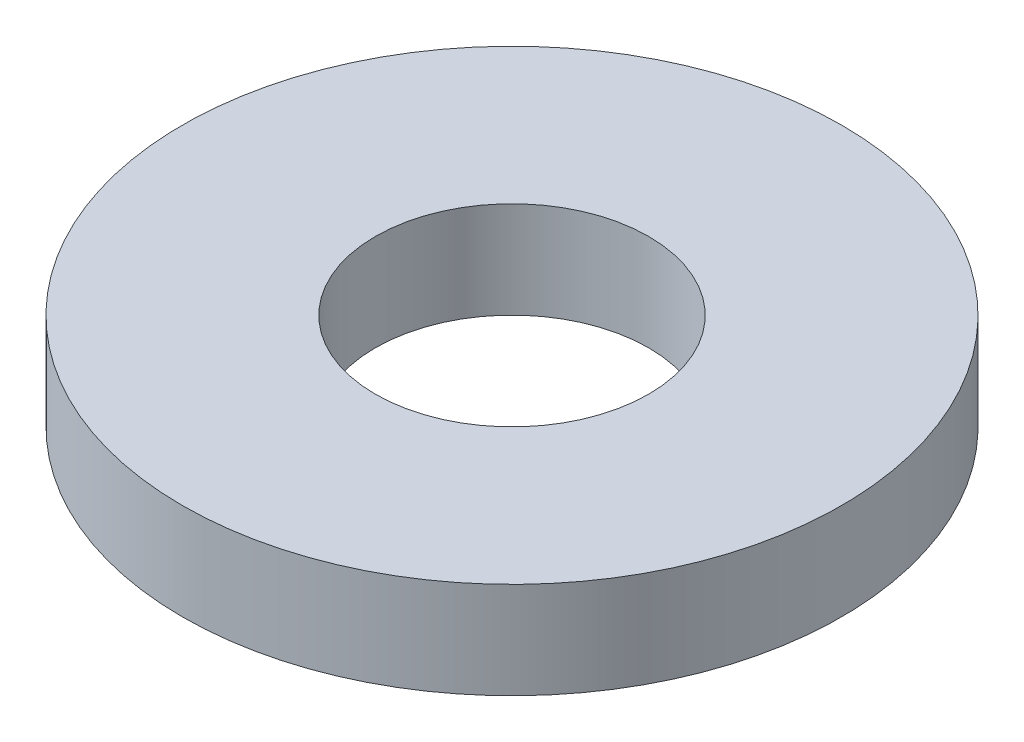
ISO-10303-21;
HEADER;
FILE_DESCRIPTION(('STEP AP214'),'2;1');
FILE_NAME('part.step','',(''),(''),'','','');
FILE_SCHEMA(('AUTOMOTIVE_DESIGN { 1 0 10303 214 1 1 1 1 }'));
ENDSEC;
DATA;
#1=APPLICATION_CONTEXT('core data for automotive mechanical design processes');
#2=APPLICATION_PROTOCOL_DEFINITION('international standard','automotive_design',2000,#1);
#3=PRODUCT_CONTEXT('',#1,'mechanical');
#4=PRODUCT('Part','Part','',(#3));
#5=PRODUCT_RELATED_PRODUCT_CATEGORY('part','',(#4));
#6=PRODUCT_DEFINITION_FORMATION('','',#4);
#7=PRODUCT_DEFINITION_CONTEXT('part definition',#1,'design');
#8=PRODUCT_DEFINITION('design','',#6,#7);
#9=PRODUCT_DEFINITION_SHAPE('','',#8);
#10=(LENGTH_UNIT() NAMED_UNIT(*) SI_UNIT(.MILLI.,.METRE.));
#11=(NAMED_UNIT(*) PLANE_ANGLE_UNIT() SI_UNIT($,.RADIAN.));
#12=(NAMED_UNIT(*) SI_UNIT($,.STERADIAN.) SOLID_ANGLE_UNIT());
#13=UNCERTAINTY_MEASURE_WITH_UNIT(LENGTH_MEASURE(1.E-05),#10,'distance_accuracy_value','');
#14=(GEOMETRIC_REPRESENTATION_CONTEXT(3) GLOBAL_UNCERTAINTY_ASSIGNED_CONTEXT((#13)) GLOBAL_UNIT_ASSIGNED_CONTEXT((#10,
#11,#12)) REPRESENTATION_CONTEXT('',''));
#15=CARTESIAN_POINT('',(0.,0.,0.));
#16=DIRECTION('',(0.,0.,1.));
#17=DIRECTION('',(1.,0.,0.));
#18=AXIS2_PLACEMENT_3D('',#15,#16,#17);
#19=CARTESIAN_POINT('',(0.,1.524,0.));
#20=DIRECTION('',(0.,1.,0.));
#21=DIRECTION('',(0.,0.,1.));
#22=AXIS2_PLACEMENT_3D('',#19,#20,#21);
#23=PLANE('',#22);
#24=CARTESIAN_POINT('',(0.,1.524,0.));
#25=DIRECTION('',(0.,1.,0.));
#26=DIRECTION('',(0.,0.,1.));
#27=AXIS2_PLACEMENT_3D('',#24,#25,#26);
#28=CIRCLE('',#27,5.207);
#29=CARTESIAN_POINT('',(0.,1.524,-5.207));
#30=VERTEX_POINT('',#29);
#31=EDGE_CURVE('E10',#30,#30,#28,.T.);
#32=ORIENTED_EDGE('',*,*,#31,.T.);
#33=EDGE_LOOP('',(#32));
#34=FACE_BOUND('',#33,.T.);
#35=CARTESIAN_POINT('',(0.,1.524,0.));
#36=DIRECTION('',(0.,1.,0.));
#37=DIRECTION('',(0.,0.,1.));
#38=AXIS2_PLACEMENT_3D('',#35,#36,#37);
#39=CIRCLE('',#38,2.159);
#40=CARTESIAN_POINT('',(0.,1.524,-2.159));
#41=VERTEX_POINT('',#40);
#42=EDGE_CURVE('E46',#41,#41,#39,.T.);
#43=ORIENTED_EDGE('',*,*,#42,.F.);
#44=EDGE_LOOP('',(#43));
#45=FACE_BOUND('',#44,.T.);
#46=ADVANCED_FACE('F35',(#34,#45),#23,.T.);
#47=CARTESIAN_POINT('',(0.,0.,0.));
#48=DIRECTION('',(0.,1.,0.));
#49=DIRECTION('',(0.,0.,1.));
#50=AXIS2_PLACEMENT_3D('',#47,#48,#49);
#51=PLANE('',#50);
#52=CARTESIAN_POINT('',(0.,0.,0.));
#53=DIRECTION('',(0.,1.,0.));
#54=DIRECTION('',(0.,0.,1.));
#55=AXIS2_PLACEMENT_3D('',#52,#53,#54);
#56=CIRCLE('',#55,5.207);
#57=CARTESIAN_POINT('',(0.,0.,-5.207));
#58=VERTEX_POINT('',#57);
#59=EDGE_CURVE('E39',#58,#58,#56,.T.);
#60=ORIENTED_EDGE('',*,*,#59,.F.);
#61=EDGE_LOOP('',(#60));
#62=FACE_BOUND('',#61,.T.);
#63=CARTESIAN_POINT('',(0.,0.,0.));
#64=DIRECTION('',(0.,1.,0.));
#65=DIRECTION('',(0.,0.,1.));
#66=AXIS2_PLACEMENT_3D('',#63,#64,#65);
#67=CIRCLE('',#66,2.159);
#68=CARTESIAN_POINT('',(0.,0.,-2.159));
#69=VERTEX_POINT('',#68);
#70=EDGE_CURVE('E48',#69,#69,#67,.T.);
#71=ORIENTED_EDGE('',*,*,#70,.T.);
#72=EDGE_LOOP('',(#71));
#73=FACE_BOUND('',#72,.T.);
#74=ADVANCED_FACE('F58',(#62,#73),#51,.F.);
#75=CARTESIAN_POINT('',(0.,1.524,0.));
#76=DIRECTION('',(0.,-1.,0.));
#77=DIRECTION('',(0.,0.,-1.));
#78=AXIS2_PLACEMENT_3D('',#75,#76,#77);
#79=CYLINDRICAL_SURFACE('',#78,5.207);
#80=CARTESIAN_POINT('',(0.,1.524,-5.207));
#81=CARTESIAN_POINT('',(0.,1.508125,-5.207));
#82=CARTESIAN_POINT('',(0.,1.49225,-5.207));
#83=CARTESIAN_POINT('',(0.,1.4605,-5.207));
#84=CARTESIAN_POINT('',(0.,1.444625,-5.207));
#85=CARTESIAN_POINT('',(0.,1.412875,-5.207));
#86=CARTESIAN_POINT('',(0.,1.397,-5.207));
#87=CARTESIAN_POINT('',(0.,1.36525,-5.207));
#88=CARTESIAN_POINT('',(0.,1.349375,-5.207));
#89=CARTESIAN_POINT('',(0.,1.317625,-5.207));
#90=CARTESIAN_POINT('',(0.,1.30175,-5.207));
#91=CARTESIAN_POINT('',(0.,1.27,-5.207));
#92=CARTESIAN_POINT('',(0.,1.254125,-5.207));
#93=CARTESIAN_POINT('',(0.,1.222375,-5.207));
#94=CARTESIAN_POINT('',(0.,1.2065,-5.207));
#95=CARTESIAN_POINT('',(0.,1.17475,-5.207));
#96=CARTESIAN_POINT('',(0.,1.158875,-5.207));
#97=CARTESIAN_POINT('',(0.,1.127125,-5.207));
#98=CARTESIAN_POINT('',(0.,1.11125,-5.207));
#99=CARTESIAN_POINT('',(0.,1.0795,-5.207));
#100=CARTESIAN_POINT('',(0.,1.063625,-5.207));
#101=CARTESIAN_POINT('',(0.,1.031875,-5.207));
#102=CARTESIAN_POINT('',(0.,1.016,-5.207));
#103=CARTESIAN_POINT('',(0.,0.98425,-5.207));
#104=CARTESIAN_POINT('',(0.,0.968375,-5.207));
#105=CARTESIAN_POINT('',(0.,0.936625,-5.207));
#106=CARTESIAN_POINT('',(0.,0.92075,-5.207));
#107=CARTESIAN_POINT('',(0.,0.889,-5.207));
#108=CARTESIAN_POINT('',(0.,0.873125,-5.207));
#109=CARTESIAN_POINT('',(0.,0.841375,-5.207));
#110=CARTESIAN_POINT('',(0.,0.8255,-5.207));
#111=CARTESIAN_POINT('',(0.,0.79375,-5.207));
#112=CARTESIAN_POINT('',(0.,0.777875,-5.207));
#113=CARTESIAN_POINT('',(0.,0.746125,-5.207));
#114=CARTESIAN_POINT('',(0.,0.73025,-5.207));
#115=CARTESIAN_POINT('',(0.,0.6985,-5.207));
#116=CARTESIAN_POINT('',(0.,0.682625,-5.207));
#117=CARTESIAN_POINT('',(0.,0.650875,-5.207));
#118=CARTESIAN_POINT('',(0.,0.635,-5.207));
#119=CARTESIAN_POINT('',(0.,0.60325,-5.207));
#120=CARTESIAN_POINT('',(0.,0.587375,-5.207));
#121=CARTESIAN_POINT('',(0.,0.555625,-5.207));
#122=CARTESIAN_POINT('',(0.,0.53975,-5.207));
#123=CARTESIAN_POINT('',(0.,0.508,-5.207));
#124=CARTESIAN_POINT('',(0.,0.492125,-5.207));
#125=CARTESIAN_POINT('',(0.,0.460375,-5.207));
#126=CARTESIAN_POINT('',(0.,0.4445,-5.207));
#127=CARTESIAN_POINT('',(0.,0.41275,-5.207));
#128=CARTESIAN_POINT('',(0.,0.396875,-5.207));
#129=CARTESIAN_POINT('',(0.,0.365125,-5.207));
#130=CARTESIAN_POINT('',(0.,0.34925,-5.207));
#131=CARTESIAN_POINT('',(0.,0.3175,-5.207));
#132=CARTESIAN_POINT('',(0.,0.301625,-5.207));
#133=CARTESIAN_POINT('',(0.,0.269875,-5.207));
#134=CARTESIAN_POINT('',(0.,0.254,-5.207));
#135=CARTESIAN_POINT('',(0.,0.22225,-5.207));
#136=CARTESIAN_POINT('',(0.,0.206375,-5.207));
#137=CARTESIAN_POINT('',(0.,0.174625,-5.207));
#138=CARTESIAN_POINT('',(0.,0.15875,-5.207));
#139=CARTESIAN_POINT('',(0.,0.127,-5.207));
#140=CARTESIAN_POINT('',(0.,0.111125,-5.207));
#141=CARTESIAN_POINT('',(0.,0.079375,-5.207));
#142=CARTESIAN_POINT('',(0.,0.0635,-5.207));
#143=CARTESIAN_POINT('',(0.,0.0317499999999999,-5.207));
#144=CARTESIAN_POINT('',(0.,0.015875,-5.207));
#145=CARTESIAN_POINT('',(0.,0.,-5.207));
#146=B_SPLINE_CURVE_WITH_KNOTS('',3,(#80,#81,#82,#83,#84,#85,#86,#87,#88,#89,#90,#91,#92,#93,
#94,#95,#96,#97,#98,#99,#100,#101,#102,#103,#104,#105,#106,#107,#108,#109,#110,#111,#112,#113,
#114,#115,#116,#117,#118,#119,#120,#121,#122,#123,#124,#125,#126,#127,#128,#129,#130,#131,#132,
#133,#134,#135,#136,#137,#138,#139,#140,#141,#142,#143,#144,#145),.UNSPECIFIED.,.F.,.F.,(4,2,2,
2,2,2,2,2,2,2,2,2,2,2,2,2,2,2,2,2,2,2,2,2,2,2,2,2,2,2,2,2,4),(0.,0.0476249999999999,
0.0952499999999998,0.142875,0.1905,0.238125,0.28575,0.333375,0.381,0.428625,0.47625,0.523875,
0.5715,0.619125,0.66675,0.714375,0.762,0.809625,0.85725,0.904875,0.9525,1.000125,1.04775,
1.095375,1.143,1.190625,1.23825,1.285875,1.3335,1.381125,1.42875,1.476375,1.524),.UNSPECIFIED.);
#147=EDGE_CURVE('BSEAM37',#30,#58,#146,.T.);
#148=ORIENTED_EDGE('',*,*,#31,.F.);
#149=ORIENTED_EDGE('',*,*,#59,.T.);
#150=ORIENTED_EDGE('',*,*,#147,.T.);
#151=ORIENTED_EDGE('',*,*,#147,.F.);
#152=EDGE_LOOP('',(#148,#150,#149,#151));
#153=FACE_BOUND('',#152,.T.);
#154=ADVANCED_FACE('F37',(#153),#79,.T.);
#155=CARTESIAN_POINT('',(0.,1.524,0.));
#156=DIRECTION('',(0.,-1.,0.));
#157=DIRECTION('',(0.,0.,-1.));
#158=AXIS2_PLACEMENT_3D('',#155,#156,#157);
#159=CYLINDRICAL_SURFACE('',#158,2.159);
#160=CARTESIAN_POINT('',(0.,1.524,-2.159));
#161=CARTESIAN_POINT('',(0.,1.508125,-2.159));
#162=CARTESIAN_POINT('',(0.,1.49225,-2.159));
#163=CARTESIAN_POINT('',(0.,1.4605,-2.159));
#164=CARTESIAN_POINT('',(0.,1.444625,-2.159));
#165=CARTESIAN_POINT('',(0.,1.412875,-2.159));
#166=CARTESIAN_POINT('',(0.,1.397,-2.159));
#167=CARTESIAN_POINT('',(0.,1.36525,-2.159));
#168=CARTESIAN_POINT('',(0.,1.349375,-2.159));
#169=CARTESIAN_POINT('',(0.,1.317625,-2.159));
#170=CARTESIAN_POINT('',(0.,1.30175,-2.159));
#171=CARTESIAN_POINT('',(0.,1.27,-2.159));
#172=CARTESIAN_POINT('',(0.,1.254125,-2.159));
#173=CARTESIAN_POINT('',(0.,1.222375,-2.159));
#174=CARTESIAN_POINT('',(0.,1.2065,-2.159));
#175=CARTESIAN_POINT('',(0.,1.17475,-2.159));
#176=CARTESIAN_POINT('',(0.,1.158875,-2.159));
#177=CARTESIAN_POINT('',(0.,1.127125,-2.159));
#178=CARTESIAN_POINT('',(0.,1.11125,-2.159));
#179=CARTESIAN_POINT('',(0.,1.0795,-2.159));
#180=CARTESIAN_POINT('',(0.,1.063625,-2.159));
#181=CARTESIAN_POINT('',(0.,1.031875,-2.159));
#182=CARTESIAN_POINT('',(0.,1.016,-2.159));
#183=CARTESIAN_POINT('',(0.,0.98425,-2.159));
#184=CARTESIAN_POINT('',(0.,0.968375,-2.159));
#185=CARTESIAN_POINT('',(0.,0.936625,-2.159));
#186=CARTESIAN_POINT('',(0.,0.92075,-2.159));
#187=CARTESIAN_POINT('',(0.,0.889,-2.159));
#188=CARTESIAN_POINT('',(0.,0.873125,-2.159));
#189=CARTESIAN_POINT('',(0.,0.841375,-2.159));
#190=CARTESIAN_POINT('',(0.,0.8255,-2.159));
#191=CARTESIAN_POINT('',(0.,0.79375,-2.159));
#192=CARTESIAN_POINT('',(0.,0.777875,-2.159));
#193=CARTESIAN_POINT('',(0.,0.746125,-2.159));
#194=CARTESIAN_POINT('',(0.,0.73025,-2.159));
#195=CARTESIAN_POINT('',(0.,0.6985,-2.159));
#196=CARTESIAN_POINT('',(0.,0.682625,-2.159));
#197=CARTESIAN_POINT('',(0.,0.650875,-2.159));
#198=CARTESIAN_POINT('',(0.,0.635,-2.159));
#199=CARTESIAN_POINT('',(0.,0.60325,-2.159));
#200=CARTESIAN_POINT('',(0.,0.587375,-2.159));
#201=CARTESIAN_POINT('',(0.,0.555625,-2.159));
#202=CARTESIAN_POINT('',(0.,0.53975,-2.159));
#203=CARTESIAN_POINT('',(0.,0.508,-2.159));
#204=CARTESIAN_POINT('',(0.,0.492125,-2.159));
#205=CARTESIAN_POINT('',(0.,0.460375,-2.159));
#206=CARTESIAN_POINT('',(0.,0.4445,-2.159));
#207=CARTESIAN_POINT('',(0.,0.41275,-2.159));
#208=CARTESIAN_POINT('',(0.,0.396875,-2.159));
#209=CARTESIAN_POINT('',(0.,0.365125,-2.159));
#210=CARTESIAN_POINT('',(0.,0.34925,-2.159));
#211=CARTESIAN_POINT('',(0.,0.3175,-2.159));
#212=CARTESIAN_POINT('',(0.,0.301625,-2.159));
#213=CARTESIAN_POINT('',(0.,0.269875,-2.159));
#214=CARTESIAN_POINT('',(0.,0.254,-2.159));
#215=CARTESIAN_POINT('',(0.,0.22225,-2.159));
#216=CARTESIAN_POINT('',(0.,0.206375,-2.159));
#217=CARTESIAN_POINT('',(0.,0.174625,-2.159));
#218=CARTESIAN_POINT('',(0.,0.15875,-2.159));
#219=CARTESIAN_POINT('',(0.,0.127,-2.159));
#220=CARTESIAN_POINT('',(0.,0.111125,-2.159));
#221=CARTESIAN_POINT('',(0.,0.079375,-2.159));
#222=CARTESIAN_POINT('',(0.,0.0635,-2.159));
#223=CARTESIAN_POINT('',(0.,0.0317499999999999,-2.159));
#224=CARTESIAN_POINT('',(0.,0.015875,-2.159));
#225=CARTESIAN_POINT('',(0.,0.,-2.159));
#226=B_SPLINE_CURVE_WITH_KNOTS('',3,(#160,#161,#162,#163,#164,#165,#166,#167,#168,#169,#170,
#171,#172,#173,#174,#175,#176,#177,#178,#179,#180,#181,#182,#183,#184,#185,#186,#187,#188,#189,
#190,#191,#192,#193,#194,#195,#196,#197,#198,#199,#200,#201,#202,#203,#204,#205,#206,#207,#208,
#209,#210,#211,#212,#213,#214,#215,#216,#217,#218,#219,#220,#221,#222,#223,#224,#225),
.UNSPECIFIED.,.F.,.F.,(4,2,2,2,2,2,2,2,2,2,2,2,2,2,2,2,2,2,2,2,2,2,2,2,2,2,2,2,2,2,2,2,4),(0.,
0.0476250000000001,0.0952500000000001,0.142875,0.1905,0.238125,0.28575,0.333375,0.381,0.428625,
0.47625,0.523875,0.5715,0.619125,0.66675,0.714375,0.762,0.809625,0.85725,0.904875,0.9525,
1.000125,1.04775,1.095375,1.143,1.190625,1.23825,1.285875,1.3335,1.381125,1.42875,1.476375,
1.524),.UNSPECIFIED.);
#227=EDGE_CURVE('BSEAM54',#41,#69,#226,.T.);
#228=ORIENTED_EDGE('',*,*,#42,.T.);
#229=ORIENTED_EDGE('',*,*,#70,.F.);
#230=ORIENTED_EDGE('',*,*,#227,.T.);
#231=ORIENTED_EDGE('',*,*,#227,.F.);
#232=EDGE_LOOP('',(#228,#230,#229,#231));
#233=FACE_BOUND('',#232,.T.);
#234=ADVANCED_FACE('F54',(#233),#159,.F.);
#235=CLOSED_SHELL('',(#46,#74,#154,#234));
#236=MANIFOLD_SOLID_BREP('B2',#235);
#237=ADVANCED_BREP_SHAPE_REPRESENTATION('',(#18,#236),#14);
#238=SHAPE_DEFINITION_REPRESENTATION(#9,#237);
ENDSEC;
END-ISO-10303-21;
